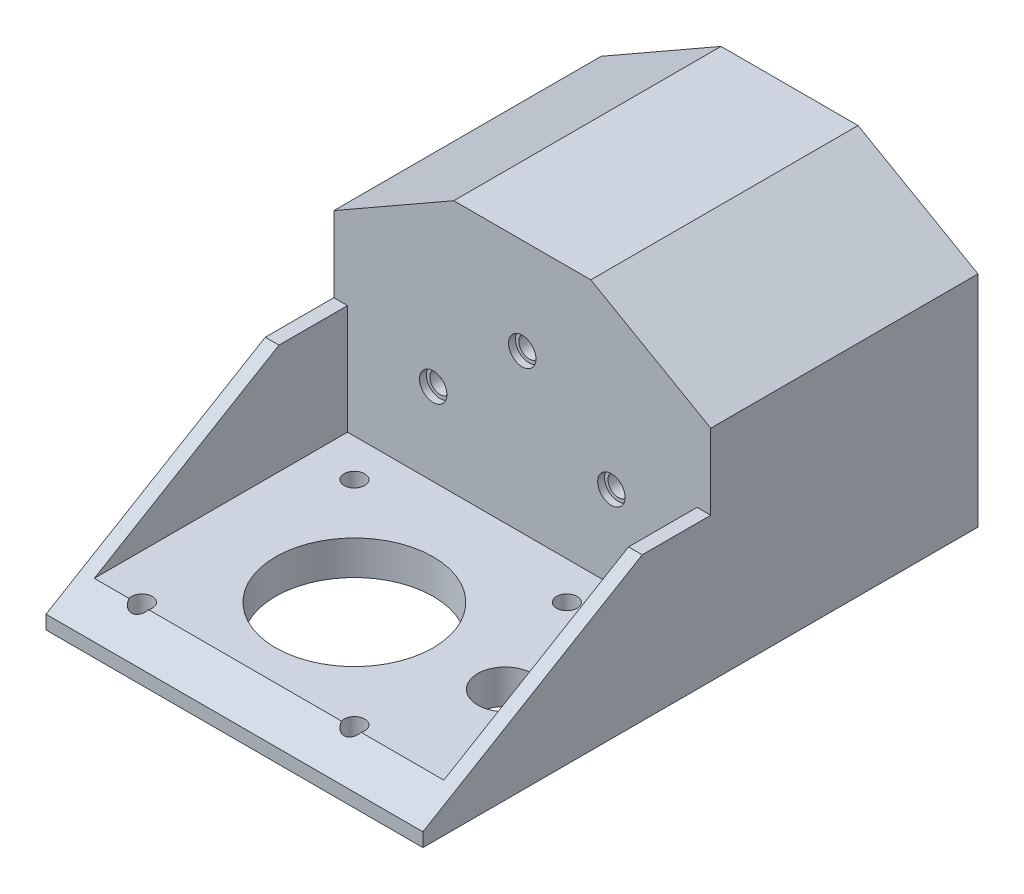
ISO-10303-21;
HEADER;
FILE_DESCRIPTION(('STEP AP214'),'2;1');
FILE_NAME('part.step','',(''),(''),'','','');
FILE_SCHEMA(('AUTOMOTIVE_DESIGN { 1 0 10303 214 1 1 1 1 }'));
ENDSEC;
DATA;
#1=APPLICATION_CONTEXT('core data for automotive mechanical design processes');
#2=APPLICATION_PROTOCOL_DEFINITION('international standard','automotive_design',2000,#1);
#3=PRODUCT_CONTEXT('',#1,'mechanical');
#4=PRODUCT('Part','Part','',(#3));
#5=PRODUCT_RELATED_PRODUCT_CATEGORY('part','',(#4));
#6=PRODUCT_DEFINITION_FORMATION('','',#4);
#7=PRODUCT_DEFINITION_CONTEXT('part definition',#1,'design');
#8=PRODUCT_DEFINITION('design','',#6,#7);
#9=PRODUCT_DEFINITION_SHAPE('','',#8);
#10=(LENGTH_UNIT() NAMED_UNIT(*) SI_UNIT(.MILLI.,.METRE.));
#11=(NAMED_UNIT(*) PLANE_ANGLE_UNIT() SI_UNIT($,.RADIAN.));
#12=(NAMED_UNIT(*) SI_UNIT($,.STERADIAN.) SOLID_ANGLE_UNIT());
#13=UNCERTAINTY_MEASURE_WITH_UNIT(LENGTH_MEASURE(1.E-05),#10,'distance_accuracy_value','');
#14=(GEOMETRIC_REPRESENTATION_CONTEXT(3) GLOBAL_UNCERTAINTY_ASSIGNED_CONTEXT((#13)) GLOBAL_UNIT_ASSIGNED_CONTEXT((#10,
#11,#12)) REPRESENTATION_CONTEXT('',''));
#15=CARTESIAN_POINT('',(0.,0.,0.));
#16=DIRECTION('',(0.,0.,1.));
#17=DIRECTION('',(1.,0.,0.));
#18=AXIS2_PLACEMENT_3D('',#15,#16,#17);
#19=CARTESIAN_POINT('',(0.,0.,39.));
#20=DIRECTION('',(0.,0.,1.));
#21=DIRECTION('',(1.,0.,0.));
#22=AXIS2_PLACEMENT_3D('',#19,#20,#21);
#23=PLANE('',#22);
#24=CARTESIAN_POINT('',(27.5,28.,39.));
#25=DIRECTION('',(0.,0.,1.));
#26=DIRECTION('',(1.,0.,0.));
#27=AXIS2_PLACEMENT_3D('',#24,#25,#26);
#28=CIRCLE('',#27,2.);
#29=CARTESIAN_POINT('',(29.5,28.,39.));
#30=VERTEX_POINT('',#29);
#31=EDGE_CURVE('E454',#30,#30,#28,.T.);
#32=ORIENTED_EDGE('',*,*,#31,.F.);
#33=EDGE_LOOP('',(#32));
#34=FACE_BOUND('',#33,.T.);
#35=CARTESIAN_POINT('',(40.5,17.,39.));
#36=DIRECTION('',(0.,0.,1.));
#37=DIRECTION('',(1.,0.,0.));
#38=AXIS2_PLACEMENT_3D('',#35,#36,#37);
#39=CIRCLE('',#38,2.);
#40=CARTESIAN_POINT('',(42.5,17.,39.));
#41=VERTEX_POINT('',#40);
#42=EDGE_CURVE('E462',#41,#41,#39,.T.);
#43=ORIENTED_EDGE('',*,*,#42,.F.);
#44=EDGE_LOOP('',(#43));
#45=FACE_BOUND('',#44,.T.);
#46=CARTESIAN_POINT('',(14.5,17.,39.));
#47=DIRECTION('',(0.,0.,1.));
#48=DIRECTION('',(1.,0.,0.));
#49=AXIS2_PLACEMENT_3D('',#46,#47,#48);
#50=CIRCLE('',#49,2.);
#51=CARTESIAN_POINT('',(16.5,17.,39.));
#52=VERTEX_POINT('',#51);
#53=EDGE_CURVE('E450',#52,#52,#50,.T.);
#54=ORIENTED_EDGE('',*,*,#53,.F.);
#55=EDGE_LOOP('',(#54));
#56=FACE_BOUND('',#55,.T.);
#57=DIRECTION('',(-1.,0.,0.));
#58=VECTOR('',#57,1.);
#59=CARTESIAN_POINT('',(55.,5.,39.));
#60=LINE('',#59,#58);
#61=CARTESIAN_POINT('',(53.,5.,39.));
#62=VERTEX_POINT('',#61);
#63=CARTESIAN_POINT('',(2.,4.99999999999999,39.));
#64=VERTEX_POINT('',#63);
#65=EDGE_CURVE('E194',#62,#64,#60,.T.);
#66=ORIENTED_EDGE('',*,*,#65,.F.);
#67=DIRECTION('',(0.,-1.,0.));
#68=VECTOR('',#67,1.);
#69=CARTESIAN_POINT('',(53.,21.,39.));
#70=LINE('',#69,#68);
#71=CARTESIAN_POINT('',(53.,21.,39.));
#72=VERTEX_POINT('',#71);
#73=EDGE_CURVE('E405',#72,#62,#70,.T.);
#74=ORIENTED_EDGE('',*,*,#73,.F.);
#75=DIRECTION('',(-1.,0.,0.));
#76=VECTOR('',#75,1.);
#77=CARTESIAN_POINT('',(55.,21.,39.));
#78=LINE('',#77,#76);
#79=CARTESIAN_POINT('',(55.,21.,39.));
#80=VERTEX_POINT('',#79);
#81=EDGE_CURVE('E426',#80,#72,#78,.T.);
#82=ORIENTED_EDGE('',*,*,#81,.F.);
#83=DIRECTION('',(0.,1.,0.));
#84=VECTOR('',#83,1.);
#85=CARTESIAN_POINT('',(55.,0.,39.));
#86=LINE('',#85,#84);
#87=CARTESIAN_POINT('',(55.,32.,39.));
#88=VERTEX_POINT('',#87);
#89=EDGE_CURVE('E112',#80,#88,#86,.T.);
#90=ORIENTED_EDGE('',*,*,#89,.T.);
#91=DIRECTION('',(-0.86824314212446,0.496138938356834,0.));
#92=VECTOR('',#91,1.);
#93=CARTESIAN_POINT('',(55.,32.,39.));
#94=LINE('',#93,#92);
#95=CARTESIAN_POINT('',(37.5,42.,39.));
#96=VERTEX_POINT('',#95);
#97=EDGE_CURVE('E215',#88,#96,#94,.T.);
#98=ORIENTED_EDGE('',*,*,#97,.T.);
#99=DIRECTION('',(-1.,0.,0.));
#100=VECTOR('',#99,1.);
#101=CARTESIAN_POINT('',(37.5,42.,39.));
#102=LINE('',#101,#100);
#103=CARTESIAN_POINT('',(17.5,42.,39.));
#104=VERTEX_POINT('',#103);
#105=EDGE_CURVE('E218',#96,#104,#102,.T.);
#106=ORIENTED_EDGE('',*,*,#105,.T.);
#107=DIRECTION('',(-0.86824314212446,-0.496138938356834,0.));
#108=VECTOR('',#107,1.);
#109=CARTESIAN_POINT('',(17.5,42.,39.));
#110=LINE('',#109,#108);
#111=CARTESIAN_POINT('',(0.,32.,39.));
#112=VERTEX_POINT('',#111);
#113=EDGE_CURVE('E78',#104,#112,#110,.T.);
#114=ORIENTED_EDGE('',*,*,#113,.T.);
#115=DIRECTION('',(0.,-1.,0.));
#116=VECTOR('',#115,1.);
#117=CARTESIAN_POINT('',(0.,32.,39.));
#118=LINE('',#117,#116);
#119=CARTESIAN_POINT('',(0.,21.,39.));
#120=VERTEX_POINT('',#119);
#121=EDGE_CURVE('E210',#112,#120,#118,.T.);
#122=ORIENTED_EDGE('',*,*,#121,.T.);
#123=DIRECTION('',(-1.,0.,0.));
#124=VECTOR('',#123,1.);
#125=CARTESIAN_POINT('',(0.,21.,39.));
#126=LINE('',#125,#124);
#127=CARTESIAN_POINT('',(2.,21.,39.));
#128=VERTEX_POINT('',#127);
#129=EDGE_CURVE('E443',#128,#120,#126,.T.);
#130=ORIENTED_EDGE('',*,*,#129,.F.);
#131=DIRECTION('',(0.,-1.,0.));
#132=VECTOR('',#131,1.);
#133=CARTESIAN_POINT('',(2.,21.,39.));
#134=LINE('',#133,#132);
#135=EDGE_CURVE('E408',#128,#64,#134,.T.);
#136=ORIENTED_EDGE('',*,*,#135,.T.);
#137=EDGE_LOOP('',(#66,#74,#82,#90,#98,#106,#114,#122,#130,#136));
#138=FACE_BOUND('',#137,.T.);
#139=ADVANCED_FACE('F54',(#34,#45,#56,#138),#23,.T.);
#140=CARTESIAN_POINT('',(55.,5.,81.0000000000001));
#141=DIRECTION('',(0.,-1.,0.));
#142=DIRECTION('',(1.,0.,0.));
#143=AXIS2_PLACEMENT_3D('',#140,#141,#142);
#144=PLANE('',#143);
#145=CARTESIAN_POINT('',(46.,5.,60.0000000000001));
#146=DIRECTION('',(0.,1.,0.));
#147=DIRECTION('',(-1.,0.,0.));
#148=AXIS2_PLACEMENT_3D('',#145,#146,#147);
#149=CIRCLE('',#148,4.00000000000001);
#150=CARTESIAN_POINT('',(42.,5.,60.0000000000001));
#151=VERTEX_POINT('',#150);
#152=EDGE_CURVE('E324',#151,#151,#149,.T.);
#153=ORIENTED_EDGE('',*,*,#152,.F.);
#154=EDGE_LOOP('',(#153));
#155=FACE_BOUND('',#154,.T.);
#156=DIRECTION('',(0.,0.,-1.));
#157=VECTOR('',#156,1.);
#158=CARTESIAN_POINT('',(2.,4.99999999999999,39.));
#159=LINE('',#158,#157);
#160=CARTESIAN_POINT('',(2.,4.99999999999999,75.9473684210527));
#161=VERTEX_POINT('',#160);
#162=EDGE_CURVE('E413',#161,#64,#159,.T.);
#163=ORIENTED_EDGE('',*,*,#162,.F.);
#164=DIRECTION('',(1.,0.,0.));
#165=VECTOR('',#164,1.);
#166=CARTESIAN_POINT('',(55.,5.,75.9473684210527));
#167=LINE('',#166,#165);
#168=CARTESIAN_POINT('',(7.06826626223839,4.99999999999999,75.9473684210527));
#169=VERTEX_POINT('',#168);
#170=EDGE_CURVE('E793',#161,#169,#167,.T.);
#171=ORIENTED_EDGE('',*,*,#170,.T.);
#172=CARTESIAN_POINT('',(8.50000000000001,4.99999999999999,75.5));
#173=DIRECTION('',(0.,1.,0.));
#174=DIRECTION('',(-1.,0.,0.));
#175=AXIS2_PLACEMENT_3D('',#172,#173,#174);
#176=CIRCLE('',#175,1.5);
#177=CARTESIAN_POINT('',(9.93173373776163,4.99999999999999,75.9473684210527));
#178=VERTEX_POINT('',#177);
#179=EDGE_CURVE('E316',#178,#169,#176,.T.);
#180=ORIENTED_EDGE('',*,*,#179,.F.);
#181=CARTESIAN_POINT('',(38.0682662622384,4.99999999999999,75.9473684210527));
#182=VERTEX_POINT('',#181);
#183=EDGE_CURVE('E798',#178,#182,#167,.T.);
#184=ORIENTED_EDGE('',*,*,#183,.T.);
#185=CARTESIAN_POINT('',(39.5,4.99999999999999,75.5));
#186=DIRECTION('',(0.,1.,0.));
#187=DIRECTION('',(-1.,0.,0.));
#188=AXIS2_PLACEMENT_3D('',#185,#186,#187);
#189=CIRCLE('',#188,1.5);
#190=CARTESIAN_POINT('',(40.9317337377617,4.99999999999999,75.9473684210527));
#191=VERTEX_POINT('',#190);
#192=EDGE_CURVE('E308',#191,#182,#189,.T.);
#193=ORIENTED_EDGE('',*,*,#192,.F.);
#194=CARTESIAN_POINT('',(53.,4.99999999999999,75.9473684210527));
#195=VERTEX_POINT('',#194);
#196=EDGE_CURVE('E418',#191,#195,#167,.T.);
#197=ORIENTED_EDGE('',*,*,#196,.T.);
#198=DIRECTION('',(0.,0.,1.));
#199=VECTOR('',#198,1.);
#200=CARTESIAN_POINT('',(53.,5.,39.));
#201=LINE('',#200,#199);
#202=EDGE_CURVE('E416',#62,#195,#201,.T.);
#203=ORIENTED_EDGE('',*,*,#202,.F.);
#204=ORIENTED_EDGE('',*,*,#65,.T.);
#205=EDGE_LOOP('',(#163,#171,#180,#184,#193,#197,#203,#204));
#206=FACE_BOUND('',#205,.T.);
#207=CARTESIAN_POINT('',(39.5,4.99999999999999,44.5));
#208=DIRECTION('',(0.,1.,0.));
#209=DIRECTION('',(-1.,0.,0.));
#210=AXIS2_PLACEMENT_3D('',#207,#208,#209);
#211=CIRCLE('',#210,1.5);
#212=CARTESIAN_POINT('',(38.,4.99999999999999,44.5));
#213=VERTEX_POINT('',#212);
#214=EDGE_CURVE('E300',#213,#213,#211,.T.);
#215=ORIENTED_EDGE('',*,*,#214,.F.);
#216=EDGE_LOOP('',(#215));
#217=FACE_BOUND('',#216,.T.);
#218=CARTESIAN_POINT('',(8.50000000000001,4.99999999999999,44.5));
#219=DIRECTION('',(0.,1.,0.));
#220=DIRECTION('',(-1.,0.,0.));
#221=AXIS2_PLACEMENT_3D('',#218,#219,#220);
#222=CIRCLE('',#221,1.5);
#223=CARTESIAN_POINT('',(7.00000000000001,4.99999999999999,44.5));
#224=VERTEX_POINT('',#223);
#225=EDGE_CURVE('E292',#224,#224,#222,.T.);
#226=ORIENTED_EDGE('',*,*,#225,.F.);
#227=EDGE_LOOP('',(#226));
#228=FACE_BOUND('',#227,.T.);
#229=CARTESIAN_POINT('',(24.,4.99999999999999,60.0000000000001));
#230=DIRECTION('',(0.,1.,0.));
#231=DIRECTION('',(-1.,0.,0.));
#232=AXIS2_PLACEMENT_3D('',#229,#230,#231);
#233=CIRCLE('',#232,11.5);
#234=CARTESIAN_POINT('',(12.5,4.99999999999999,60.0000000000001));
#235=VERTEX_POINT('',#234);
#236=EDGE_CURVE('E204',#235,#235,#233,.T.);
#237=ORIENTED_EDGE('',*,*,#236,.F.);
#238=EDGE_LOOP('',(#237));
#239=FACE_BOUND('',#238,.T.);
#240=ADVANCED_FACE('F339',(#155,#206,#217,#228,#239),#144,.F.);
#241=CARTESIAN_POINT('',(14.5,17.,0.));
#242=DIRECTION('',(0.,0.,1.));
#243=DIRECTION('',(1.,0.,0.));
#244=AXIS2_PLACEMENT_3D('',#241,#242,#243);
#245=CYLINDRICAL_SURFACE('',#244,1.5);
#246=CARTESIAN_POINT('',(14.5,17.,0.));
#247=DIRECTION('',(0.,0.,1.));
#248=DIRECTION('',(-1.,0.,0.));
#249=AXIS2_PLACEMENT_3D('',#246,#247,#248);
#250=CIRCLE('',#249,1.5);
#251=CARTESIAN_POINT('',(13.,17.,0.));
#252=VERTEX_POINT('',#251);
#253=EDGE_CURVE('E271',#252,#252,#250,.T.);
#254=ORIENTED_EDGE('',*,*,#253,.F.);
#255=EDGE_LOOP('',(#254));
#256=FACE_BOUND('',#255,.T.);
#257=CARTESIAN_POINT('',(14.5,17.,38.));
#258=DIRECTION('',(0.,0.,1.));
#259=DIRECTION('',(1.,0.,0.));
#260=AXIS2_PLACEMENT_3D('',#257,#258,#259);
#261=CIRCLE('',#260,1.5);
#262=CARTESIAN_POINT('',(16.,17.,38.));
#263=VERTEX_POINT('',#262);
#264=EDGE_CURVE('E268',#263,#263,#261,.F.);
#265=ORIENTED_EDGE('',*,*,#264,.F.);
#266=EDGE_LOOP('',(#265));
#267=FACE_BOUND('',#266,.T.);
#268=ADVANCED_FACE('F341',(#256,#267),#245,.F.);
#269=CARTESIAN_POINT('',(40.5,17.,0.));
#270=DIRECTION('',(0.,0.,1.));
#271=DIRECTION('',(1.,0.,0.));
#272=AXIS2_PLACEMENT_3D('',#269,#270,#271);
#273=CYLINDRICAL_SURFACE('',#272,1.5);
#274=CARTESIAN_POINT('',(40.5,17.,0.));
#275=DIRECTION('',(0.,0.,1.));
#276=DIRECTION('',(1.,0.,0.));
#277=AXIS2_PLACEMENT_3D('',#274,#275,#276);
#278=CIRCLE('',#277,1.5);
#279=CARTESIAN_POINT('',(42.,17.,0.));
#280=VERTEX_POINT('',#279);
#281=EDGE_CURVE('E277',#280,#280,#278,.T.);
#282=ORIENTED_EDGE('',*,*,#281,.F.);
#283=EDGE_LOOP('',(#282));
#284=FACE_BOUND('',#283,.T.);
#285=CARTESIAN_POINT('',(40.5,17.,38.));
#286=DIRECTION('',(0.,0.,1.));
#287=DIRECTION('',(1.,0.,0.));
#288=AXIS2_PLACEMENT_3D('',#285,#286,#287);
#289=CIRCLE('',#288,1.5);
#290=CARTESIAN_POINT('',(42.,17.,38.));
#291=VERTEX_POINT('',#290);
#292=EDGE_CURVE('E264',#291,#291,#289,.F.);
#293=ORIENTED_EDGE('',*,*,#292,.F.);
#294=EDGE_LOOP('',(#293));
#295=FACE_BOUND('',#294,.T.);
#296=ADVANCED_FACE('F348',(#284,#295),#273,.F.);
#297=CARTESIAN_POINT('',(27.5,28.,0.));
#298=DIRECTION('',(0.,0.,1.));
#299=DIRECTION('',(1.,0.,0.));
#300=AXIS2_PLACEMENT_3D('',#297,#298,#299);
#301=CYLINDRICAL_SURFACE('',#300,1.5);
#302=CARTESIAN_POINT('',(27.5,28.,0.));
#303=DIRECTION('',(0.,0.,1.));
#304=DIRECTION('',(1.,0.,0.));
#305=AXIS2_PLACEMENT_3D('',#302,#303,#304);
#306=CIRCLE('',#305,1.5);
#307=CARTESIAN_POINT('',(29.,28.,0.));
#308=VERTEX_POINT('',#307);
#309=EDGE_CURVE('E284',#308,#308,#306,.T.);
#310=ORIENTED_EDGE('',*,*,#309,.F.);
#311=EDGE_LOOP('',(#310));
#312=FACE_BOUND('',#311,.T.);
#313=CARTESIAN_POINT('',(27.5,28.,38.));
#314=DIRECTION('',(0.,0.,1.));
#315=DIRECTION('',(1.,0.,0.));
#316=AXIS2_PLACEMENT_3D('',#313,#314,#315);
#317=CIRCLE('',#316,1.5);
#318=CARTESIAN_POINT('',(29.,28.,38.));
#319=VERTEX_POINT('',#318);
#320=EDGE_CURVE('E260',#319,#319,#317,.F.);
#321=ORIENTED_EDGE('',*,*,#320,.F.);
#322=EDGE_LOOP('',(#321));
#323=FACE_BOUND('',#322,.T.);
#324=ADVANCED_FACE('F380',(#312,#323),#301,.F.);
#325=CARTESIAN_POINT('',(0.,32.,39.));
#326=DIRECTION('',(1.,0.,0.));
#327=DIRECTION('',(0.,1.,0.));
#328=AXIS2_PLACEMENT_3D('',#325,#326,#327);
#329=PLANE('',#328);
#330=DIRECTION('',(0.,-1.,0.));
#331=VECTOR('',#330,1.);
#332=CARTESIAN_POINT('',(0.,4.99999999999999,81.0000000000001));
#333=LINE('',#332,#331);
#334=CARTESIAN_POINT('',(0.,2.,81.0000000000001));
#335=VERTEX_POINT('',#334);
#336=CARTESIAN_POINT('',(0.,0.,81.0000000000001));
#337=VERTEX_POINT('',#336);
#338=EDGE_CURVE('E193',#335,#337,#333,.T.);
#339=ORIENTED_EDGE('',*,*,#338,.F.);
#340=DIRECTION('',(0.,0.510538754155436,-0.859854743840735));
#341=VECTOR('',#340,1.);
#342=CARTESIAN_POINT('',(0.,28.2570397111913,36.7776173285198));
#343=LINE('',#342,#341);
#344=CARTESIAN_POINT('',(0.,21.,49.));
#345=VERTEX_POINT('',#344);
#346=EDGE_CURVE('E172',#335,#345,#343,.T.);
#347=ORIENTED_EDGE('',*,*,#346,.T.);
#348=DIRECTION('',(0.,0.,1.));
#349=VECTOR('',#348,1.);
#350=CARTESIAN_POINT('',(0.,21.,39.));
#351=LINE('',#350,#349);
#352=EDGE_CURVE('E436',#120,#345,#351,.T.);
#353=ORIENTED_EDGE('',*,*,#352,.F.);
#354=ORIENTED_EDGE('',*,*,#121,.F.);
#355=DIRECTION('',(0.,0.,-1.));
#356=VECTOR('',#355,1.);
#357=CARTESIAN_POINT('',(0.,32.,39.));
#358=LINE('',#357,#356);
#359=CARTESIAN_POINT('',(0.,32.,0.));
#360=VERTEX_POINT('',#359);
#361=EDGE_CURVE('E223',#112,#360,#358,.T.);
#362=ORIENTED_EDGE('',*,*,#361,.T.);
#363=DIRECTION('',(0.,-1.,0.));
#364=VECTOR('',#363,1.);
#365=CARTESIAN_POINT('',(0.,32.,0.));
#366=LINE('',#365,#364);
#367=CARTESIAN_POINT('',(0.,0.,0.));
#368=VERTEX_POINT('',#367);
#369=EDGE_CURVE('E208',#360,#368,#366,.T.);
#370=ORIENTED_EDGE('',*,*,#369,.T.);
#371=DIRECTION('',(0.,0.,-1.));
#372=VECTOR('',#371,1.);
#373=CARTESIAN_POINT('',(0.,0.,39.));
#374=LINE('',#373,#372);
#375=EDGE_CURVE('E63',#337,#368,#374,.T.);
#376=ORIENTED_EDGE('',*,*,#375,.F.);
#377=EDGE_LOOP('',(#339,#347,#353,#354,#362,#370,#376));
#378=FACE_BOUND('',#377,.T.);
#379=ADVANCED_FACE('F56',(#378),#329,.F.);
#380=CARTESIAN_POINT('',(0.,0.,39.));
#381=DIRECTION('',(0.,1.,0.));
#382=DIRECTION('',(0.,0.,1.));
#383=AXIS2_PLACEMENT_3D('',#380,#381,#382);
#384=PLANE('',#383);
#385=CARTESIAN_POINT('',(46.,0.,60.0000000000001));
#386=DIRECTION('',(0.,1.,0.));
#387=DIRECTION('',(-1.,0.,0.));
#388=AXIS2_PLACEMENT_3D('',#385,#386,#387);
#389=CIRCLE('',#388,4.00000000000001);
#390=CARTESIAN_POINT('',(42.,0.,60.0000000000001));
#391=VERTEX_POINT('',#390);
#392=EDGE_CURVE('E320',#391,#391,#389,.T.);
#393=ORIENTED_EDGE('',*,*,#392,.T.);
#394=EDGE_LOOP('',(#393));
#395=FACE_BOUND('',#394,.T.);
#396=CARTESIAN_POINT('',(8.50000000000001,0.,75.5));
#397=DIRECTION('',(0.,1.,0.));
#398=DIRECTION('',(-1.,0.,0.));
#399=AXIS2_PLACEMENT_3D('',#396,#397,#398);
#400=CIRCLE('',#399,1.5);
#401=CARTESIAN_POINT('',(7.00000000000001,0.,75.5));
#402=VERTEX_POINT('',#401);
#403=EDGE_CURVE('E312',#402,#402,#400,.T.);
#404=ORIENTED_EDGE('',*,*,#403,.T.);
#405=EDGE_LOOP('',(#404));
#406=FACE_BOUND('',#405,.T.);
#407=CARTESIAN_POINT('',(39.5,0.,75.5));
#408=DIRECTION('',(0.,1.,0.));
#409=DIRECTION('',(-1.,0.,0.));
#410=AXIS2_PLACEMENT_3D('',#407,#408,#409);
#411=CIRCLE('',#410,1.5);
#412=CARTESIAN_POINT('',(38.,0.,75.5));
#413=VERTEX_POINT('',#412);
#414=EDGE_CURVE('E304',#413,#413,#411,.T.);
#415=ORIENTED_EDGE('',*,*,#414,.T.);
#416=EDGE_LOOP('',(#415));
#417=FACE_BOUND('',#416,.T.);
#418=CARTESIAN_POINT('',(39.5,0.,44.5));
#419=DIRECTION('',(0.,1.,0.));
#420=DIRECTION('',(-1.,0.,0.));
#421=AXIS2_PLACEMENT_3D('',#418,#419,#420);
#422=CIRCLE('',#421,1.5);
#423=CARTESIAN_POINT('',(38.,0.,44.5));
#424=VERTEX_POINT('',#423);
#425=EDGE_CURVE('E296',#424,#424,#422,.T.);
#426=ORIENTED_EDGE('',*,*,#425,.T.);
#427=EDGE_LOOP('',(#426));
#428=FACE_BOUND('',#427,.T.);
#429=CARTESIAN_POINT('',(8.50000000000001,0.,44.5));
#430=DIRECTION('',(0.,1.,0.));
#431=DIRECTION('',(-1.,0.,0.));
#432=AXIS2_PLACEMENT_3D('',#429,#430,#431);
#433=CIRCLE('',#432,1.5);
#434=CARTESIAN_POINT('',(7.00000000000001,0.,44.5));
#435=VERTEX_POINT('',#434);
#436=EDGE_CURVE('E288',#435,#435,#433,.T.);
#437=ORIENTED_EDGE('',*,*,#436,.T.);
#438=EDGE_LOOP('',(#437));
#439=FACE_BOUND('',#438,.T.);
#440=CARTESIAN_POINT('',(24.,0.,60.0000000000001));
#441=DIRECTION('',(0.,1.,0.));
#442=DIRECTION('',(-1.,0.,0.));
#443=AXIS2_PLACEMENT_3D('',#440,#441,#442);
#444=CIRCLE('',#443,11.5);
#445=CARTESIAN_POINT('',(12.5,0.,60.0000000000001));
#446=VERTEX_POINT('',#445);
#447=EDGE_CURVE('E201',#446,#446,#444,.T.);
#448=ORIENTED_EDGE('',*,*,#447,.T.);
#449=EDGE_LOOP('',(#448));
#450=FACE_BOUND('',#449,.T.);
#451=DIRECTION('',(1.,0.,0.));
#452=VECTOR('',#451,1.);
#453=CARTESIAN_POINT('',(0.,0.,0.));
#454=LINE('',#453,#452);
#455=CARTESIAN_POINT('',(55.,0.,0.));
#456=VERTEX_POINT('',#455);
#457=EDGE_CURVE('E227',#368,#456,#454,.T.);
#458=ORIENTED_EDGE('',*,*,#457,.T.);
#459=DIRECTION('',(0.,0.,-1.));
#460=VECTOR('',#459,1.);
#461=CARTESIAN_POINT('',(55.,0.,39.));
#462=LINE('',#461,#460);
#463=CARTESIAN_POINT('',(55.,0.,81.0000000000001));
#464=VERTEX_POINT('',#463);
#465=EDGE_CURVE('E254',#464,#456,#462,.T.);
#466=ORIENTED_EDGE('',*,*,#465,.F.);
#467=DIRECTION('',(1.,0.,0.));
#468=VECTOR('',#467,1.);
#469=CARTESIAN_POINT('',(55.,0.,81.0000000000001));
#470=LINE('',#469,#468);
#471=EDGE_CURVE('E191',#337,#464,#470,.T.);
#472=ORIENTED_EDGE('',*,*,#471,.F.);
#473=ORIENTED_EDGE('',*,*,#375,.T.);
#474=EDGE_LOOP('',(#458,#466,#472,#473));
#475=FACE_BOUND('',#474,.T.);
#476=ADVANCED_FACE('F374',(#395,#406,#417,#428,#439,#450,#475),#384,.F.);
#477=CARTESIAN_POINT('',(55.,0.,39.));
#478=DIRECTION('',(-1.,0.,0.));
#479=DIRECTION('',(0.,0.,1.));
#480=AXIS2_PLACEMENT_3D('',#477,#478,#479);
#481=PLANE('',#480);
#482=DIRECTION('',(0.,0.,-1.));
#483=VECTOR('',#482,1.);
#484=CARTESIAN_POINT('',(55.,21.,39.));
#485=LINE('',#484,#483);
#486=CARTESIAN_POINT('',(55.,21.,49.));
#487=VERTEX_POINT('',#486);
#488=EDGE_CURVE('E185',#487,#80,#485,.T.);
#489=ORIENTED_EDGE('',*,*,#488,.F.);
#490=DIRECTION('',(0.,0.510538754155436,-0.859854743840735));
#491=VECTOR('',#490,1.);
#492=CARTESIAN_POINT('',(55.,2.,81.0000000000001));
#493=LINE('',#492,#491);
#494=CARTESIAN_POINT('',(55.,2.,81.0000000000001));
#495=VERTEX_POINT('',#494);
#496=EDGE_CURVE('E70',#495,#487,#493,.T.);
#497=ORIENTED_EDGE('',*,*,#496,.F.);
#498=DIRECTION('',(0.,1.,0.));
#499=VECTOR('',#498,1.);
#500=CARTESIAN_POINT('',(55.,5.,81.0000000000001));
#501=LINE('',#500,#499);
#502=EDGE_CURVE('E184',#464,#495,#501,.T.);
#503=ORIENTED_EDGE('',*,*,#502,.F.);
#504=ORIENTED_EDGE('',*,*,#465,.T.);
#505=DIRECTION('',(0.,1.,0.));
#506=VECTOR('',#505,1.);
#507=CARTESIAN_POINT('',(55.,0.,0.));
#508=LINE('',#507,#506);
#509=CARTESIAN_POINT('',(55.,32.,0.));
#510=VERTEX_POINT('',#509);
#511=EDGE_CURVE('E230',#456,#510,#508,.T.);
#512=ORIENTED_EDGE('',*,*,#511,.T.);
#513=DIRECTION('',(0.,0.,-1.));
#514=VECTOR('',#513,1.);
#515=CARTESIAN_POINT('',(55.,32.,39.));
#516=LINE('',#515,#514);
#517=EDGE_CURVE('E250',#88,#510,#516,.T.);
#518=ORIENTED_EDGE('',*,*,#517,.F.);
#519=ORIENTED_EDGE('',*,*,#89,.F.);
#520=EDGE_LOOP('',(#489,#497,#503,#504,#512,#518,#519));
#521=FACE_BOUND('',#520,.T.);
#522=ADVANCED_FACE('F182',(#521),#481,.F.);
#523=CARTESIAN_POINT('',(55.,32.,39.));
#524=DIRECTION('',(-0.496138938356835,-0.868243142124459,0.));
#525=DIRECTION('',(0.86824314212446,-0.496138938356834,0.));
#526=AXIS2_PLACEMENT_3D('',#523,#524,#525);
#527=PLANE('',#526);
#528=DIRECTION('',(-0.86824314212446,0.496138938356834,0.));
#529=VECTOR('',#528,1.);
#530=CARTESIAN_POINT('',(55.,32.,0.));
#531=LINE('',#530,#529);
#532=CARTESIAN_POINT('',(37.5,42.,0.));
#533=VERTEX_POINT('',#532);
#534=EDGE_CURVE('E233',#510,#533,#531,.T.);
#535=ORIENTED_EDGE('',*,*,#534,.T.);
#536=DIRECTION('',(0.,0.,-1.));
#537=VECTOR('',#536,1.);
#538=CARTESIAN_POINT('',(37.5,42.,39.));
#539=LINE('',#538,#537);
#540=EDGE_CURVE('E246',#96,#533,#539,.T.);
#541=ORIENTED_EDGE('',*,*,#540,.F.);
#542=ORIENTED_EDGE('',*,*,#97,.F.);
#543=ORIENTED_EDGE('',*,*,#517,.T.);
#544=EDGE_LOOP('',(#535,#541,#542,#543));
#545=FACE_BOUND('',#544,.T.);
#546=ADVANCED_FACE('F368',(#545),#527,.F.);
#547=CARTESIAN_POINT('',(37.5,42.,39.));
#548=DIRECTION('',(0.,-1.,0.));
#549=DIRECTION('',(0.,0.,-1.));
#550=AXIS2_PLACEMENT_3D('',#547,#548,#549);
#551=PLANE('',#550);
#552=DIRECTION('',(-1.,0.,0.));
#553=VECTOR('',#552,1.);
#554=CARTESIAN_POINT('',(37.5,42.,0.));
#555=LINE('',#554,#553);
#556=CARTESIAN_POINT('',(17.5,42.,0.));
#557=VERTEX_POINT('',#556);
#558=EDGE_CURVE('E236',#533,#557,#555,.T.);
#559=ORIENTED_EDGE('',*,*,#558,.T.);
#560=DIRECTION('',(0.,0.,-1.));
#561=VECTOR('',#560,1.);
#562=CARTESIAN_POINT('',(17.5,42.,39.));
#563=LINE('',#562,#561);
#564=EDGE_CURVE('E243',#104,#557,#563,.T.);
#565=ORIENTED_EDGE('',*,*,#564,.F.);
#566=ORIENTED_EDGE('',*,*,#105,.F.);
#567=ORIENTED_EDGE('',*,*,#540,.T.);
#568=EDGE_LOOP('',(#559,#565,#566,#567));
#569=FACE_BOUND('',#568,.T.);
#570=ADVANCED_FACE('F365',(#569),#551,.F.);
#571=CARTESIAN_POINT('',(17.5,42.,39.));
#572=DIRECTION('',(0.496138938356834,-0.868243142124459,0.));
#573=DIRECTION('',(0.86824314212446,0.496138938356834,0.));
#574=AXIS2_PLACEMENT_3D('',#571,#572,#573);
#575=PLANE('',#574);
#576=DIRECTION('',(-0.86824314212446,-0.496138938356834,0.));
#577=VECTOR('',#576,1.);
#578=CARTESIAN_POINT('',(17.5,42.,0.));
#579=LINE('',#578,#577);
#580=EDGE_CURVE('E105',#557,#360,#579,.T.);
#581=ORIENTED_EDGE('',*,*,#580,.T.);
#582=ORIENTED_EDGE('',*,*,#361,.F.);
#583=ORIENTED_EDGE('',*,*,#113,.F.);
#584=ORIENTED_EDGE('',*,*,#564,.T.);
#585=EDGE_LOOP('',(#581,#582,#583,#584));
#586=FACE_BOUND('',#585,.T.);
#587=ADVANCED_FACE('F361',(#586),#575,.F.);
#588=CARTESIAN_POINT('',(0.,0.,0.));
#589=DIRECTION('',(0.,0.,1.));
#590=DIRECTION('',(1.,0.,0.));
#591=AXIS2_PLACEMENT_3D('',#588,#589,#590);
#592=PLANE('',#591);
#593=ORIENTED_EDGE('',*,*,#309,.T.);
#594=EDGE_LOOP('',(#593));
#595=FACE_BOUND('',#594,.T.);
#596=ORIENTED_EDGE('',*,*,#281,.T.);
#597=EDGE_LOOP('',(#596));
#598=FACE_BOUND('',#597,.T.);
#599=ORIENTED_EDGE('',*,*,#253,.T.);
#600=EDGE_LOOP('',(#599));
#601=FACE_BOUND('',#600,.T.);
#602=ORIENTED_EDGE('',*,*,#369,.F.);
#603=ORIENTED_EDGE('',*,*,#580,.F.);
#604=ORIENTED_EDGE('',*,*,#558,.F.);
#605=ORIENTED_EDGE('',*,*,#534,.F.);
#606=ORIENTED_EDGE('',*,*,#511,.F.);
#607=ORIENTED_EDGE('',*,*,#457,.F.);
#608=EDGE_LOOP('',(#602,#603,#604,#605,#606,#607));
#609=FACE_BOUND('',#608,.T.);
#610=ADVANCED_FACE('F358',(#595,#598,#601,#609),#592,.F.);
#611=CARTESIAN_POINT('',(0.,0.,81.0000000000001));
#612=DIRECTION('',(0.,0.,-1.));
#613=DIRECTION('',(-1.,0.,0.));
#614=AXIS2_PLACEMENT_3D('',#611,#612,#613);
#615=PLANE('',#614);
#616=ORIENTED_EDGE('',*,*,#502,.T.);
#617=DIRECTION('',(1.,0.,0.));
#618=VECTOR('',#617,1.);
#619=CARTESIAN_POINT('',(-45.,2.,81.0000000000001));
#620=LINE('',#619,#618);
#621=EDGE_CURVE('E169',#335,#495,#620,.T.);
#622=ORIENTED_EDGE('',*,*,#621,.F.);
#623=ORIENTED_EDGE('',*,*,#338,.T.);
#624=ORIENTED_EDGE('',*,*,#471,.T.);
#625=EDGE_LOOP('',(#616,#622,#623,#624));
#626=FACE_BOUND('',#625,.T.);
#627=ADVANCED_FACE('F189',(#626),#615,.F.);
#628=CARTESIAN_POINT('',(24.,0.,60.0000000000001));
#629=DIRECTION('',(0.,1.,0.));
#630=DIRECTION('',(-1.,0.,0.));
#631=AXIS2_PLACEMENT_3D('',#628,#629,#630);
#632=CYLINDRICAL_SURFACE('',#631,11.5);
#633=ORIENTED_EDGE('',*,*,#447,.F.);
#634=EDGE_LOOP('',(#633));
#635=FACE_BOUND('',#634,.T.);
#636=ORIENTED_EDGE('',*,*,#236,.T.);
#637=EDGE_LOOP('',(#636));
#638=FACE_BOUND('',#637,.T.);
#639=ADVANCED_FACE('F337',(#635,#638),#632,.F.);
#640=CARTESIAN_POINT('',(8.50000000000001,0.,44.5));
#641=DIRECTION('',(0.,1.,0.));
#642=DIRECTION('',(-1.,0.,0.));
#643=AXIS2_PLACEMENT_3D('',#640,#641,#642);
#644=CYLINDRICAL_SURFACE('',#643,1.5);
#645=ORIENTED_EDGE('',*,*,#436,.F.);
#646=EDGE_LOOP('',(#645));
#647=FACE_BOUND('',#646,.T.);
#648=ORIENTED_EDGE('',*,*,#225,.T.);
#649=EDGE_LOOP('',(#648));
#650=FACE_BOUND('',#649,.T.);
#651=ADVANCED_FACE('F521',(#647,#650),#644,.F.);
#652=CARTESIAN_POINT('',(39.5,0.,44.5));
#653=DIRECTION('',(0.,1.,0.));
#654=DIRECTION('',(-1.,0.,0.));
#655=AXIS2_PLACEMENT_3D('',#652,#653,#654);
#656=CYLINDRICAL_SURFACE('',#655,1.5);
#657=ORIENTED_EDGE('',*,*,#425,.F.);
#658=EDGE_LOOP('',(#657));
#659=FACE_BOUND('',#658,.T.);
#660=ORIENTED_EDGE('',*,*,#214,.T.);
#661=EDGE_LOOP('',(#660));
#662=FACE_BOUND('',#661,.T.);
#663=ADVANCED_FACE('F524',(#659,#662),#656,.F.);
#664=CARTESIAN_POINT('',(39.5,0.,75.5));
#665=DIRECTION('',(0.,1.,0.));
#666=DIRECTION('',(-1.,0.,0.));
#667=AXIS2_PLACEMENT_3D('',#664,#665,#666);
#668=CYLINDRICAL_SURFACE('',#667,1.5);
#669=ORIENTED_EDGE('',*,*,#414,.F.);
#670=EDGE_LOOP('',(#669));
#671=FACE_BOUND('',#670,.T.);
#672=ORIENTED_EDGE('',*,*,#192,.T.);
#673=CARTESIAN_POINT('',(39.5,5.265625,75.5));
#674=DIRECTION('',(0.,-0.859854743840735,-0.510538754155436));
#675=DIRECTION('',(0.,0.510538754155436,-0.859854743840735));
#676=AXIS2_PLACEMENT_3D('',#673,#674,#675);
#677=ELLIPSE('',#676,1.74448069368079,1.5);
#678=EDGE_CURVE('E799',#182,#191,#677,.F.);
#679=ORIENTED_EDGE('',*,*,#678,.T.);
#680=EDGE_LOOP('',(#672,#679));
#681=FACE_BOUND('',#680,.T.);
#682=ADVANCED_FACE('F528',(#671,#681),#668,.F.);
#683=CARTESIAN_POINT('',(8.50000000000001,0.,75.5));
#684=DIRECTION('',(0.,1.,0.));
#685=DIRECTION('',(-1.,0.,0.));
#686=AXIS2_PLACEMENT_3D('',#683,#684,#685);
#687=CYLINDRICAL_SURFACE('',#686,1.5);
#688=ORIENTED_EDGE('',*,*,#403,.F.);
#689=EDGE_LOOP('',(#688));
#690=FACE_BOUND('',#689,.T.);
#691=ORIENTED_EDGE('',*,*,#179,.T.);
#692=CARTESIAN_POINT('',(8.50000000000001,5.26562500000001,75.5));
#693=DIRECTION('',(0.,-0.859854743840735,-0.510538754155436));
#694=DIRECTION('',(0.,0.510538754155436,-0.859854743840735));
#695=AXIS2_PLACEMENT_3D('',#692,#693,#694);
#696=ELLIPSE('',#695,1.74448069368079,1.5);
#697=EDGE_CURVE('E794',#169,#178,#696,.F.);
#698=ORIENTED_EDGE('',*,*,#697,.T.);
#699=EDGE_LOOP('',(#691,#698));
#700=FACE_BOUND('',#699,.T.);
#701=ADVANCED_FACE('F496',(#690,#700),#687,.F.);
#702=CARTESIAN_POINT('',(46.,0.,60.0000000000001));
#703=DIRECTION('',(0.,1.,0.));
#704=DIRECTION('',(-1.,0.,0.));
#705=AXIS2_PLACEMENT_3D('',#702,#703,#704);
#706=CYLINDRICAL_SURFACE('',#705,4.00000000000001);
#707=ORIENTED_EDGE('',*,*,#392,.F.);
#708=EDGE_LOOP('',(#707));
#709=FACE_BOUND('',#708,.T.);
#710=ORIENTED_EDGE('',*,*,#152,.T.);
#711=EDGE_LOOP('',(#710));
#712=FACE_BOUND('',#711,.T.);
#713=ADVANCED_FACE('F486',(#709,#712),#706,.F.);
#714=CARTESIAN_POINT('',(27.5,28.,38.));
#715=DIRECTION('',(0.,0.,1.));
#716=DIRECTION('',(1.,0.,0.));
#717=AXIS2_PLACEMENT_3D('',#714,#715,#716);
#718=PLANE('',#717);
#719=CARTESIAN_POINT('',(27.5,28.,38.));
#720=DIRECTION('',(0.,0.,1.));
#721=DIRECTION('',(1.,0.,0.));
#722=AXIS2_PLACEMENT_3D('',#719,#720,#721);
#723=CIRCLE('',#722,2.);
#724=CARTESIAN_POINT('',(29.5,28.,38.));
#725=VERTEX_POINT('',#724);
#726=EDGE_CURVE('E265',#725,#725,#723,.T.);
#727=ORIENTED_EDGE('',*,*,#726,.T.);
#728=EDGE_LOOP('',(#727));
#729=FACE_BOUND('',#728,.T.);
#730=ORIENTED_EDGE('',*,*,#320,.T.);
#731=EDGE_LOOP('',(#730));
#732=FACE_BOUND('',#731,.T.);
#733=ADVANCED_FACE('F483',(#729,#732),#718,.T.);
#734=CARTESIAN_POINT('',(27.5,28.,38.));
#735=DIRECTION('',(0.,0.,1.));
#736=DIRECTION('',(1.,0.,0.));
#737=AXIS2_PLACEMENT_3D('',#734,#735,#736);
#738=CYLINDRICAL_SURFACE('',#737,2.);
#739=ORIENTED_EDGE('',*,*,#726,.F.);
#740=EDGE_LOOP('',(#739));
#741=FACE_BOUND('',#740,.T.);
#742=ORIENTED_EDGE('',*,*,#31,.T.);
#743=EDGE_LOOP('',(#742));
#744=FACE_BOUND('',#743,.T.);
#745=ADVANCED_FACE('F485',(#741,#744),#738,.F.);
#746=CARTESIAN_POINT('',(40.5,17.,38.));
#747=DIRECTION('',(0.,0.,1.));
#748=DIRECTION('',(1.,0.,0.));
#749=AXIS2_PLACEMENT_3D('',#746,#747,#748);
#750=PLANE('',#749);
#751=CARTESIAN_POINT('',(40.5,17.,38.));
#752=DIRECTION('',(0.,0.,1.));
#753=DIRECTION('',(1.,0.,0.));
#754=AXIS2_PLACEMENT_3D('',#751,#752,#753);
#755=CIRCLE('',#754,2.);
#756=CARTESIAN_POINT('',(42.5,17.,38.));
#757=VERTEX_POINT('',#756);
#758=EDGE_CURVE('E458',#757,#757,#755,.T.);
#759=ORIENTED_EDGE('',*,*,#758,.T.);
#760=EDGE_LOOP('',(#759));
#761=FACE_BOUND('',#760,.T.);
#762=ORIENTED_EDGE('',*,*,#292,.T.);
#763=EDGE_LOOP('',(#762));
#764=FACE_BOUND('',#763,.T.);
#765=ADVANCED_FACE('F493',(#761,#764),#750,.T.);
#766=CARTESIAN_POINT('',(40.5,17.,38.));
#767=DIRECTION('',(0.,0.,1.));
#768=DIRECTION('',(1.,0.,0.));
#769=AXIS2_PLACEMENT_3D('',#766,#767,#768);
#770=CYLINDRICAL_SURFACE('',#769,2.);
#771=ORIENTED_EDGE('',*,*,#758,.F.);
#772=EDGE_LOOP('',(#771));
#773=FACE_BOUND('',#772,.T.);
#774=ORIENTED_EDGE('',*,*,#42,.T.);
#775=EDGE_LOOP('',(#774));
#776=FACE_BOUND('',#775,.T.);
#777=ADVANCED_FACE('F505',(#773,#776),#770,.F.);
#778=CARTESIAN_POINT('',(14.5,17.,38.));
#779=DIRECTION('',(0.,0.,1.));
#780=DIRECTION('',(1.,0.,0.));
#781=AXIS2_PLACEMENT_3D('',#778,#779,#780);
#782=PLANE('',#781);
#783=CARTESIAN_POINT('',(14.5,17.,38.));
#784=DIRECTION('',(0.,0.,1.));
#785=DIRECTION('',(1.,0.,0.));
#786=AXIS2_PLACEMENT_3D('',#783,#784,#785);
#787=CIRCLE('',#786,2.);
#788=CARTESIAN_POINT('',(16.5,17.,38.));
#789=VERTEX_POINT('',#788);
#790=EDGE_CURVE('E466',#789,#789,#787,.T.);
#791=ORIENTED_EDGE('',*,*,#790,.T.);
#792=EDGE_LOOP('',(#791));
#793=FACE_BOUND('',#792,.T.);
#794=ORIENTED_EDGE('',*,*,#264,.T.);
#795=EDGE_LOOP('',(#794));
#796=FACE_BOUND('',#795,.T.);
#797=ADVANCED_FACE('F509',(#793,#796),#782,.T.);
#798=CARTESIAN_POINT('',(14.5,17.,38.));
#799=DIRECTION('',(0.,0.,1.));
#800=DIRECTION('',(1.,0.,0.));
#801=AXIS2_PLACEMENT_3D('',#798,#799,#800);
#802=CYLINDRICAL_SURFACE('',#801,2.);
#803=ORIENTED_EDGE('',*,*,#790,.F.);
#804=EDGE_LOOP('',(#803));
#805=FACE_BOUND('',#804,.T.);
#806=ORIENTED_EDGE('',*,*,#53,.T.);
#807=EDGE_LOOP('',(#806));
#808=FACE_BOUND('',#807,.T.);
#809=ADVANCED_FACE('F513',(#805,#808),#802,.F.);
#810=CARTESIAN_POINT('',(2.,21.,39.));
#811=DIRECTION('',(-1.,0.,0.));
#812=DIRECTION('',(0.,0.,1.));
#813=AXIS2_PLACEMENT_3D('',#810,#811,#812);
#814=PLANE('',#813);
#815=DIRECTION('',(0.,0.,-1.));
#816=VECTOR('',#815,1.);
#817=CARTESIAN_POINT('',(2.,21.,39.));
#818=LINE('',#817,#816);
#819=CARTESIAN_POINT('',(2.,21.,49.));
#820=VERTEX_POINT('',#819);
#821=EDGE_CURVE('E440',#820,#128,#818,.T.);
#822=ORIENTED_EDGE('',*,*,#821,.F.);
#823=DIRECTION('',(0.,-0.510538754155436,0.859854743840735));
#824=VECTOR('',#823,1.);
#825=CARTESIAN_POINT('',(2.,25.3898916967509,41.6064981949459));
#826=LINE('',#825,#824);
#827=EDGE_CURVE('E428',#820,#161,#826,.T.);
#828=ORIENTED_EDGE('',*,*,#827,.T.);
#829=ORIENTED_EDGE('',*,*,#162,.T.);
#830=ORIENTED_EDGE('',*,*,#135,.F.);
#831=EDGE_LOOP('',(#822,#828,#829,#830));
#832=FACE_BOUND('',#831,.T.);
#833=ADVANCED_FACE('F500',(#832),#814,.F.);
#834=CARTESIAN_POINT('',(0.,21.,0.));
#835=DIRECTION('',(0.,1.,0.));
#836=DIRECTION('',(0.,0.,1.));
#837=AXIS2_PLACEMENT_3D('',#834,#835,#836);
#838=PLANE('',#837);
#839=DIRECTION('',(1.,0.,0.));
#840=VECTOR('',#839,1.);
#841=CARTESIAN_POINT('',(-45.,21.,49.));
#842=LINE('',#841,#840);
#843=EDGE_CURVE('E177',#345,#820,#842,.T.);
#844=ORIENTED_EDGE('',*,*,#843,.T.);
#845=ORIENTED_EDGE('',*,*,#821,.T.);
#846=ORIENTED_EDGE('',*,*,#129,.T.);
#847=ORIENTED_EDGE('',*,*,#352,.T.);
#848=EDGE_LOOP('',(#844,#845,#846,#847));
#849=FACE_BOUND('',#848,.T.);
#850=ADVANCED_FACE('F640',(#849),#838,.T.);
#851=CARTESIAN_POINT('',(53.,21.,39.));
#852=DIRECTION('',(1.,0.,0.));
#853=DIRECTION('',(0.,1.,0.));
#854=AXIS2_PLACEMENT_3D('',#851,#852,#853);
#855=PLANE('',#854);
#856=ORIENTED_EDGE('',*,*,#202,.T.);
#857=DIRECTION('',(0.,0.510538754155436,-0.859854743840735));
#858=VECTOR('',#857,1.);
#859=CARTESIAN_POINT('',(53.,25.3898916967509,41.6064981949459));
#860=LINE('',#859,#858);
#861=CARTESIAN_POINT('',(53.,21.,49.));
#862=VERTEX_POINT('',#861);
#863=EDGE_CURVE('E805',#195,#862,#860,.T.);
#864=ORIENTED_EDGE('',*,*,#863,.T.);
#865=DIRECTION('',(0.,0.,1.));
#866=VECTOR('',#865,1.);
#867=CARTESIAN_POINT('',(53.,21.,39.));
#868=LINE('',#867,#866);
#869=EDGE_CURVE('E432',#72,#862,#868,.T.);
#870=ORIENTED_EDGE('',*,*,#869,.F.);
#871=ORIENTED_EDGE('',*,*,#73,.T.);
#872=EDGE_LOOP('',(#856,#864,#870,#871));
#873=FACE_BOUND('',#872,.T.);
#874=ADVANCED_FACE('F650',(#873),#855,.F.);
#875=CARTESIAN_POINT('',(0.,21.,0.));
#876=DIRECTION('',(0.,-1.,0.));
#877=DIRECTION('',(1.,0.,0.));
#878=AXIS2_PLACEMENT_3D('',#875,#876,#877);
#879=PLANE('',#878);
#880=ORIENTED_EDGE('',*,*,#869,.T.);
#881=DIRECTION('',(1.,0.,0.));
#882=VECTOR('',#881,1.);
#883=CARTESIAN_POINT('',(0.,21.,49.));
#884=LINE('',#883,#882);
#885=EDGE_CURVE('E13',#862,#487,#884,.T.);
#886=ORIENTED_EDGE('',*,*,#885,.T.);
#887=ORIENTED_EDGE('',*,*,#488,.T.);
#888=ORIENTED_EDGE('',*,*,#81,.T.);
#889=EDGE_LOOP('',(#880,#886,#887,#888));
#890=FACE_BOUND('',#889,.T.);
#891=ADVANCED_FACE('F659',(#890),#879,.F.);
#892=CARTESIAN_POINT('',(-45.,2.,81.0000000000001));
#893=DIRECTION('',(0.,-0.859854743840735,-0.510538754155436));
#894=DIRECTION('',(0.,0.510538754155436,-0.859854743840735));
#895=AXIS2_PLACEMENT_3D('',#892,#893,#894);
#896=PLANE('',#895);
#897=ORIENTED_EDGE('',*,*,#621,.T.);
#898=ORIENTED_EDGE('',*,*,#496,.T.);
#899=ORIENTED_EDGE('',*,*,#885,.F.);
#900=ORIENTED_EDGE('',*,*,#863,.F.);
#901=ORIENTED_EDGE('',*,*,#196,.F.);
#902=ORIENTED_EDGE('',*,*,#678,.F.);
#903=ORIENTED_EDGE('',*,*,#183,.F.);
#904=ORIENTED_EDGE('',*,*,#697,.F.);
#905=ORIENTED_EDGE('',*,*,#170,.F.);
#906=ORIENTED_EDGE('',*,*,#827,.F.);
#907=ORIENTED_EDGE('',*,*,#843,.F.);
#908=ORIENTED_EDGE('',*,*,#346,.F.);
#909=EDGE_LOOP('',(#897,#898,#899,#900,#901,#902,#903,#904,#905,#906,#907,#908));
#910=FACE_BOUND('',#909,.T.);
#911=ADVANCED_FACE('F170',(#910),#896,.F.);
#912=CLOSED_SHELL('',(#139,#240,#268,#296,#324,#379,#476,#522,#546,#570,#587,#610,#627,#639,
#651,#663,#682,#701,#713,#733,#745,#765,#777,#797,#809,#833,#850,#874,#891,#911));
#913=MANIFOLD_SOLID_BREP('B2',#912);
#914=ADVANCED_BREP_SHAPE_REPRESENTATION('',(#18,#913),#14);
#915=SHAPE_DEFINITION_REPRESENTATION(#9,#914);
ENDSEC;
END-ISO-10303-21;
